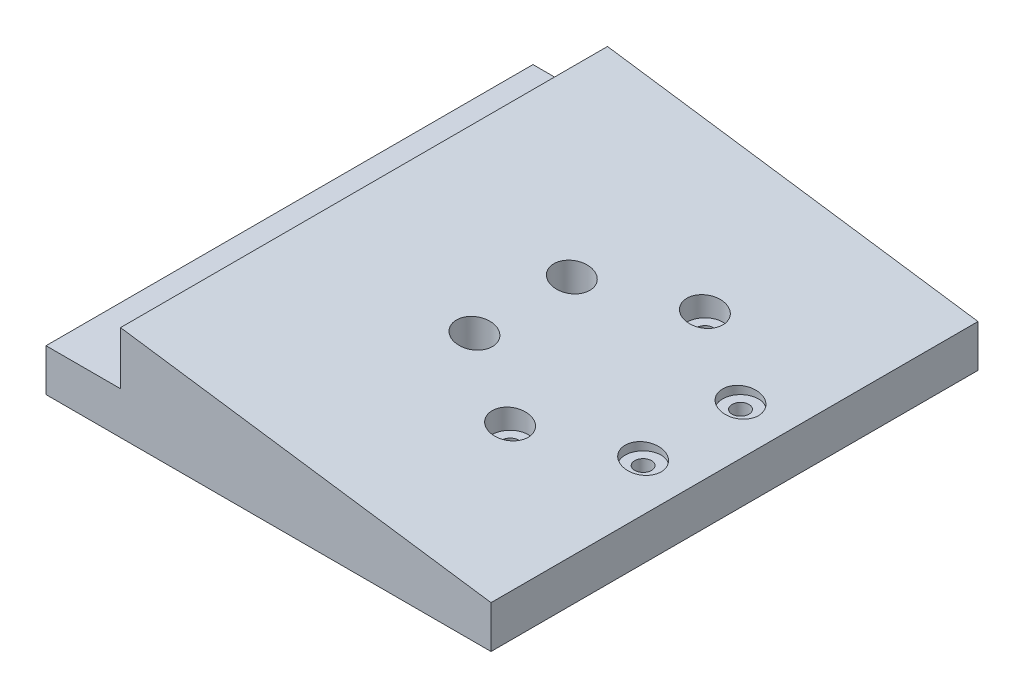
ISO-10303-21;
HEADER;
FILE_DESCRIPTION(('STEP AP214'),'2;1');
FILE_NAME('part.step','',(''),(''),'','','');
FILE_SCHEMA(('AUTOMOTIVE_DESIGN { 1 0 10303 214 1 1 1 1 }'));
ENDSEC;
DATA;
#1=APPLICATION_CONTEXT('core data for automotive mechanical design processes');
#2=APPLICATION_PROTOCOL_DEFINITION('international standard','automotive_design',2000,#1);
#3=PRODUCT_CONTEXT('',#1,'mechanical');
#4=PRODUCT('Part','Part','',(#3));
#5=PRODUCT_RELATED_PRODUCT_CATEGORY('part','',(#4));
#6=PRODUCT_DEFINITION_FORMATION('','',#4);
#7=PRODUCT_DEFINITION_CONTEXT('part definition',#1,'design');
#8=PRODUCT_DEFINITION('design','',#6,#7);
#9=PRODUCT_DEFINITION_SHAPE('','',#8);
#10=(LENGTH_UNIT() NAMED_UNIT(*) SI_UNIT(.MILLI.,.METRE.));
#11=(NAMED_UNIT(*) PLANE_ANGLE_UNIT() SI_UNIT($,.RADIAN.));
#12=(NAMED_UNIT(*) SI_UNIT($,.STERADIAN.) SOLID_ANGLE_UNIT());
#13=UNCERTAINTY_MEASURE_WITH_UNIT(LENGTH_MEASURE(1.E-05),#10,'distance_accuracy_value','');
#14=(GEOMETRIC_REPRESENTATION_CONTEXT(3) GLOBAL_UNCERTAINTY_ASSIGNED_CONTEXT((#13)) GLOBAL_UNIT_ASSIGNED_CONTEXT((#10,
#11,#12)) REPRESENTATION_CONTEXT('',''));
#15=CARTESIAN_POINT('',(0.,0.,0.));
#16=DIRECTION('',(0.,0.,1.));
#17=DIRECTION('',(1.,0.,0.));
#18=AXIS2_PLACEMENT_3D('',#15,#16,#17);
#19=CARTESIAN_POINT('',(52.55,10.,-57.5));
#20=DIRECTION('',(-1.,0.,0.));
#21=DIRECTION('',(0.,0.,1.));
#22=AXIS2_PLACEMENT_3D('',#19,#20,#21);
#23=PLANE('',#22);
#24=DIRECTION('',(0.,0.,-1.));
#25=VECTOR('',#24,1.);
#26=CARTESIAN_POINT('',(52.55,0.,-57.5));
#27=LINE('',#26,#25);
#28=CARTESIAN_POINT('',(52.55,0.,57.5));
#29=VERTEX_POINT('',#28);
#30=CARTESIAN_POINT('',(52.55,0.,-57.5));
#31=VERTEX_POINT('',#30);
#32=EDGE_CURVE('E103',#29,#31,#27,.T.);
#33=ORIENTED_EDGE('',*,*,#32,.T.);
#34=DIRECTION('',(0.,-1.,0.));
#35=VECTOR('',#34,1.);
#36=CARTESIAN_POINT('',(52.55,10.,-57.5));
#37=LINE('',#36,#35);
#38=CARTESIAN_POINT('',(52.55,10.,-57.5));
#39=VERTEX_POINT('',#38);
#40=EDGE_CURVE('E11',#39,#31,#37,.T.);
#41=ORIENTED_EDGE('',*,*,#40,.F.);
#42=DIRECTION('',(0.,0.,-1.));
#43=VECTOR('',#42,1.);
#44=CARTESIAN_POINT('',(52.55,10.,-57.5));
#45=LINE('',#44,#43);
#46=CARTESIAN_POINT('',(52.55,10.,57.5));
#47=VERTEX_POINT('',#46);
#48=EDGE_CURVE('E114',#47,#39,#45,.T.);
#49=ORIENTED_EDGE('',*,*,#48,.F.);
#50=DIRECTION('',(0.,-1.,0.));
#51=VECTOR('',#50,1.);
#52=CARTESIAN_POINT('',(52.55,10.,57.5));
#53=LINE('',#52,#51);
#54=EDGE_CURVE('E58',#47,#29,#53,.T.);
#55=ORIENTED_EDGE('',*,*,#54,.T.);
#56=EDGE_LOOP('',(#33,#41,#49,#55));
#57=FACE_BOUND('',#56,.T.);
#58=ADVANCED_FACE('F33',(#57),#23,.F.);
#59=CARTESIAN_POINT('',(-52.55,10.,-57.5));
#60=DIRECTION('',(0.,0.,1.));
#61=DIRECTION('',(1.,0.,0.));
#62=AXIS2_PLACEMENT_3D('',#59,#60,#61);
#63=PLANE('',#62);
#64=DIRECTION('',(-1.,0.,0.));
#65=VECTOR('',#64,1.);
#66=CARTESIAN_POINT('',(-52.55,0.,-57.5));
#67=LINE('',#66,#65);
#68=CARTESIAN_POINT('',(-52.55,0.,-57.5));
#69=VERTEX_POINT('',#68);
#70=EDGE_CURVE('E129',#31,#69,#67,.T.);
#71=ORIENTED_EDGE('',*,*,#70,.T.);
#72=DIRECTION('',(0.,-1.,0.));
#73=VECTOR('',#72,1.);
#74=CARTESIAN_POINT('',(-52.55,10.,-57.5));
#75=LINE('',#74,#73);
#76=CARTESIAN_POINT('',(-52.55,10.,-57.5));
#77=VERTEX_POINT('',#76);
#78=EDGE_CURVE('E41',#77,#69,#75,.T.);
#79=ORIENTED_EDGE('',*,*,#78,.F.);
#80=DIRECTION('',(-1.,0.,0.));
#81=VECTOR('',#80,1.);
#82=CARTESIAN_POINT('',(-52.55,10.,-57.5));
#83=LINE('',#82,#81);
#84=CARTESIAN_POINT('',(-34.9499999999986,10.,-57.5));
#85=VERTEX_POINT('',#84);
#86=EDGE_CURVE('E110',#85,#77,#83,.T.);
#87=ORIENTED_EDGE('',*,*,#86,.F.);
#88=DIRECTION('',(0.,-1.,0.));
#89=VECTOR('',#88,1.);
#90=CARTESIAN_POINT('',(-34.9499999999983,22.5000000000006,-57.5));
#91=LINE('',#90,#89);
#92=CARTESIAN_POINT('',(-34.9499999999983,22.5000000000006,-57.5));
#93=VERTEX_POINT('',#92);
#94=EDGE_CURVE('E97',#93,#85,#91,.T.);
#95=ORIENTED_EDGE('',*,*,#94,.F.);
#96=DIRECTION('',(-0.989949493661165,0.141421356237319,0.));
#97=VECTOR('',#96,1.);
#98=CARTESIAN_POINT('',(52.55,10.,-57.5));
#99=LINE('',#98,#97);
#100=EDGE_CURVE('E108',#39,#93,#99,.T.);
#101=ORIENTED_EDGE('',*,*,#100,.F.);
#102=ORIENTED_EDGE('',*,*,#40,.T.);
#103=EDGE_LOOP('',(#71,#79,#87,#95,#101,#102));
#104=FACE_BOUND('',#103,.T.);
#105=ADVANCED_FACE('F107',(#104),#63,.F.);
#106=CARTESIAN_POINT('',(-52.55,10.,-57.5));
#107=DIRECTION('',(1.,0.,0.));
#108=DIRECTION('',(0.,0.,-1.));
#109=AXIS2_PLACEMENT_3D('',#106,#107,#108);
#110=PLANE('',#109);
#111=DIRECTION('',(0.,0.,1.));
#112=VECTOR('',#111,1.);
#113=CARTESIAN_POINT('',(-52.55,0.,-57.5));
#114=LINE('',#113,#112);
#115=CARTESIAN_POINT('',(-52.55,0.,57.5));
#116=VERTEX_POINT('',#115);
#117=EDGE_CURVE('E131',#69,#116,#114,.T.);
#118=ORIENTED_EDGE('',*,*,#117,.T.);
#119=DIRECTION('',(0.,-1.,0.));
#120=VECTOR('',#119,1.);
#121=CARTESIAN_POINT('',(-52.55,10.,57.5));
#122=LINE('',#121,#120);
#123=CARTESIAN_POINT('',(-52.55,10.,57.5));
#124=VERTEX_POINT('',#123);
#125=EDGE_CURVE('E135',#124,#116,#122,.T.);
#126=ORIENTED_EDGE('',*,*,#125,.F.);
#127=DIRECTION('',(0.,0.,1.));
#128=VECTOR('',#127,1.);
#129=CARTESIAN_POINT('',(-52.55,10.,-57.5));
#130=LINE('',#129,#128);
#131=EDGE_CURVE('E124',#77,#124,#130,.T.);
#132=ORIENTED_EDGE('',*,*,#131,.F.);
#133=ORIENTED_EDGE('',*,*,#78,.T.);
#134=EDGE_LOOP('',(#118,#126,#132,#133));
#135=FACE_BOUND('',#134,.T.);
#136=ADVANCED_FACE('F215',(#135),#110,.F.);
#137=CARTESIAN_POINT('',(-52.55,10.,57.5));
#138=DIRECTION('',(0.,0.,-1.));
#139=DIRECTION('',(-1.,0.,0.));
#140=AXIS2_PLACEMENT_3D('',#137,#138,#139);
#141=PLANE('',#140);
#142=DIRECTION('',(1.,0.,0.));
#143=VECTOR('',#142,1.);
#144=CARTESIAN_POINT('',(-52.55,0.,57.5));
#145=LINE('',#144,#143);
#146=EDGE_CURVE('E78',#116,#29,#145,.T.);
#147=ORIENTED_EDGE('',*,*,#146,.T.);
#148=ORIENTED_EDGE('',*,*,#54,.F.);
#149=DIRECTION('',(-0.989949493661165,0.141421356237319,0.));
#150=VECTOR('',#149,1.);
#151=CARTESIAN_POINT('',(52.55,10.,57.5));
#152=LINE('',#151,#150);
#153=CARTESIAN_POINT('',(-34.9499999999983,22.5000000000006,57.5));
#154=VERTEX_POINT('',#153);
#155=EDGE_CURVE('E111',#47,#154,#152,.T.);
#156=ORIENTED_EDGE('',*,*,#155,.T.);
#157=DIRECTION('',(0.,-1.,0.));
#158=VECTOR('',#157,1.);
#159=CARTESIAN_POINT('',(-34.9499999999983,22.5000000000006,57.5));
#160=LINE('',#159,#158);
#161=CARTESIAN_POINT('',(-34.9499999999986,10.0000000000005,57.5));
#162=VERTEX_POINT('',#161);
#163=EDGE_CURVE('E99',#154,#162,#160,.T.);
#164=ORIENTED_EDGE('',*,*,#163,.T.);
#165=DIRECTION('',(1.,0.,0.));
#166=VECTOR('',#165,1.);
#167=CARTESIAN_POINT('',(-52.55,10.,57.5));
#168=LINE('',#167,#166);
#169=EDGE_CURVE('E126',#124,#162,#168,.T.);
#170=ORIENTED_EDGE('',*,*,#169,.F.);
#171=ORIENTED_EDGE('',*,*,#125,.T.);
#172=EDGE_LOOP('',(#147,#148,#156,#164,#170,#171));
#173=FACE_BOUND('',#172,.T.);
#174=ADVANCED_FACE('F210',(#173),#141,.F.);
#175=CARTESIAN_POINT('',(0.,10.,0.));
#176=DIRECTION('',(0.,1.,0.));
#177=DIRECTION('',(0.,0.,1.));
#178=AXIS2_PLACEMENT_3D('',#175,#176,#177);
#179=PLANE('',#178);
#180=DIRECTION('',(0.,0.,1.));
#181=VECTOR('',#180,1.);
#182=CARTESIAN_POINT('',(-34.9499999999986,10.0000000000005,-57.5));
#183=LINE('',#182,#181);
#184=EDGE_CURVE('E49',#85,#162,#183,.T.);
#185=ORIENTED_EDGE('',*,*,#184,.F.);
#186=ORIENTED_EDGE('',*,*,#86,.T.);
#187=ORIENTED_EDGE('',*,*,#131,.T.);
#188=ORIENTED_EDGE('',*,*,#169,.T.);
#189=EDGE_LOOP('',(#185,#186,#187,#188));
#190=FACE_BOUND('',#189,.T.);
#191=ADVANCED_FACE('F201',(#190),#179,.T.);
#192=CARTESIAN_POINT('',(0.,0.,0.));
#193=DIRECTION('',(0.,1.,0.));
#194=DIRECTION('',(0.,0.,1.));
#195=AXIS2_PLACEMENT_3D('',#192,#193,#194);
#196=PLANE('',#195);
#197=CARTESIAN_POINT('',(22.55,0.,23.));
#198=DIRECTION('',(0.,-1.,0.));
#199=DIRECTION('',(0.,0.,-1.));
#200=AXIS2_PLACEMENT_3D('',#197,#198,#199);
#201=CIRCLE('',#200,2.);
#202=CARTESIAN_POINT('',(22.55,0.,21.));
#203=VERTEX_POINT('',#202);
#204=EDGE_CURVE('E120',#203,#203,#201,.T.);
#205=ORIENTED_EDGE('',*,*,#204,.F.);
#206=EDGE_LOOP('',(#205));
#207=FACE_BOUND('',#206,.T.);
#208=CARTESIAN_POINT('',(42.4685842870423,0.,11.5000000000008));
#209=DIRECTION('',(0.,-1.,0.));
#210=DIRECTION('',(0.,0.,-1.));
#211=AXIS2_PLACEMENT_3D('',#208,#209,#210);
#212=CIRCLE('',#211,2.00000000000001);
#213=CARTESIAN_POINT('',(42.4685842870423,0.,9.50000000000078));
#214=VERTEX_POINT('',#213);
#215=EDGE_CURVE('E174',#214,#214,#212,.T.);
#216=ORIENTED_EDGE('',*,*,#215,.F.);
#217=EDGE_LOOP('',(#216));
#218=FACE_BOUND('',#217,.T.);
#219=CARTESIAN_POINT('',(42.468584287043,0.,-11.4999999999994));
#220=DIRECTION('',(0.,-1.,0.));
#221=DIRECTION('',(0.,0.,-1.));
#222=AXIS2_PLACEMENT_3D('',#219,#220,#221);
#223=CIRCLE('',#222,1.99999999999979);
#224=CARTESIAN_POINT('',(42.468584287043,0.,-13.4999999999992));
#225=VERTEX_POINT('',#224);
#226=EDGE_CURVE('E178',#225,#225,#223,.T.);
#227=ORIENTED_EDGE('',*,*,#226,.F.);
#228=EDGE_LOOP('',(#227));
#229=FACE_BOUND('',#228,.T.);
#230=CARTESIAN_POINT('',(22.5500000000013,0.,-23.));
#231=DIRECTION('',(0.,-1.,0.));
#232=DIRECTION('',(0.,0.,-1.));
#233=AXIS2_PLACEMENT_3D('',#230,#231,#232);
#234=CIRCLE('',#233,1.99999999999985);
#235=CARTESIAN_POINT('',(22.5500000000013,0.,-24.9999999999998));
#236=VERTEX_POINT('',#235);
#237=EDGE_CURVE('E183',#236,#236,#234,.T.);
#238=ORIENTED_EDGE('',*,*,#237,.F.);
#239=EDGE_LOOP('',(#238));
#240=FACE_BOUND('',#239,.T.);
#241=CARTESIAN_POINT('',(2.63141571295887,0.,-11.5000000000006));
#242=DIRECTION('',(0.,-1.,0.));
#243=DIRECTION('',(0.,0.,-1.));
#244=AXIS2_PLACEMENT_3D('',#241,#242,#243);
#245=CIRCLE('',#244,1.9999999999999);
#246=CARTESIAN_POINT('',(2.63141571295887,0.,-13.5000000000005));
#247=VERTEX_POINT('',#246);
#248=EDGE_CURVE('E190',#247,#247,#245,.T.);
#249=ORIENTED_EDGE('',*,*,#248,.F.);
#250=EDGE_LOOP('',(#249));
#251=FACE_BOUND('',#250,.T.);
#252=CARTESIAN_POINT('',(2.6314157129582,0.,11.4999999999994));
#253=DIRECTION('',(0.,-1.,0.));
#254=DIRECTION('',(0.,0.,-1.));
#255=AXIS2_PLACEMENT_3D('',#252,#253,#254);
#256=CIRCLE('',#255,2.);
#257=CARTESIAN_POINT('',(2.6314157129582,0.,9.49999999999939));
#258=VERTEX_POINT('',#257);
#259=EDGE_CURVE('E187',#258,#258,#256,.T.);
#260=ORIENTED_EDGE('',*,*,#259,.F.);
#261=EDGE_LOOP('',(#260));
#262=FACE_BOUND('',#261,.T.);
#263=ORIENTED_EDGE('',*,*,#32,.F.);
#264=ORIENTED_EDGE('',*,*,#146,.F.);
#265=ORIENTED_EDGE('',*,*,#117,.F.);
#266=ORIENTED_EDGE('',*,*,#70,.F.);
#267=EDGE_LOOP('',(#263,#264,#265,#266));
#268=FACE_BOUND('',#267,.T.);
#269=ADVANCED_FACE('F198',(#207,#218,#229,#240,#251,#262,#268),#196,.F.);
#270=CARTESIAN_POINT('',(-34.9499999999983,22.5000000000006,-57.5));
#271=DIRECTION('',(-1.,0.,0.));
#272=DIRECTION('',(0.,-1.,0.));
#273=AXIS2_PLACEMENT_3D('',#270,#271,#272);
#274=PLANE('',#273);
#275=ORIENTED_EDGE('',*,*,#163,.F.);
#276=DIRECTION('',(0.,0.,1.));
#277=VECTOR('',#276,1.);
#278=CARTESIAN_POINT('',(-34.9499999999983,22.5000000000006,-57.5));
#279=LINE('',#278,#277);
#280=EDGE_CURVE('E94',#93,#154,#279,.T.);
#281=ORIENTED_EDGE('',*,*,#280,.F.);
#282=ORIENTED_EDGE('',*,*,#94,.T.);
#283=ORIENTED_EDGE('',*,*,#184,.T.);
#284=EDGE_LOOP('',(#275,#281,#282,#283));
#285=FACE_BOUND('',#284,.T.);
#286=ADVANCED_FACE('F96',(#285),#274,.T.);
#287=CARTESIAN_POINT('',(52.55,10.,-57.5));
#288=DIRECTION('',(0.141421356237319,0.989949493661165,0.));
#289=DIRECTION('',(-0.989949493661165,0.141421356237319,0.));
#290=AXIS2_PLACEMENT_3D('',#287,#288,#289);
#291=PLANE('',#290);
#292=CARTESIAN_POINT('',(22.55,14.2857142857146,-23.));
#293=DIRECTION('',(0.141421356237319,0.989949493661165,0.));
#294=DIRECTION('',(-0.989949493661165,0.141421356237319,0.));
#295=AXIS2_PLACEMENT_3D('',#292,#293,#294);
#296=ELLIPSE('',#295,4.2931483143469,4.25);
#297=CARTESIAN_POINT('',(18.3,14.8928571428575,-23.));
#298=VERTEX_POINT('',#297);
#299=EDGE_CURVE('E36',#298,#298,#296,.F.);
#300=ORIENTED_EDGE('',*,*,#299,.T.);
#301=EDGE_LOOP('',(#300));
#302=FACE_BOUND('',#301,.T.);
#303=CARTESIAN_POINT('',(42.4685842870416,11.4402022447084,-11.4999999999997));
#304=DIRECTION('',(0.141421356237319,0.989949493661165,0.));
#305=DIRECTION('',(-0.989949493661165,0.141421356237319,0.));
#306=AXIS2_PLACEMENT_3D('',#303,#304,#305);
#307=ELLIPSE('',#306,4.2931483143469,4.25);
#308=CARTESIAN_POINT('',(38.2185842870416,12.0473451018513,-11.4999999999997));
#309=VERTEX_POINT('',#308);
#310=EDGE_CURVE('E169',#309,#309,#307,.F.);
#311=ORIENTED_EDGE('',*,*,#310,.T.);
#312=EDGE_LOOP('',(#311));
#313=FACE_BOUND('',#312,.T.);
#314=CARTESIAN_POINT('',(42.4685842870412,11.4402022447085,11.5000000000004));
#315=DIRECTION('',(0.141421356237319,0.989949493661165,0.));
#316=DIRECTION('',(-0.989949493661165,0.141421356237319,0.));
#317=AXIS2_PLACEMENT_3D('',#314,#315,#316);
#318=ELLIPSE('',#317,4.2931483143469,4.25);
#319=CARTESIAN_POINT('',(38.2185842870412,12.0473451018514,11.5000000000004));
#320=VERTEX_POINT('',#319);
#321=EDGE_CURVE('E167',#320,#320,#318,.F.);
#322=ORIENTED_EDGE('',*,*,#321,.T.);
#323=EDGE_LOOP('',(#322));
#324=FACE_BOUND('',#323,.T.);
#325=CARTESIAN_POINT('',(22.55,14.2857142857146,23.));
#326=DIRECTION('',(0.141421356237319,0.989949493661165,0.));
#327=DIRECTION('',(-0.989949493661165,0.141421356237319,0.));
#328=AXIS2_PLACEMENT_3D('',#325,#326,#327);
#329=ELLIPSE('',#328,4.29314831434581,4.24999999999892);
#330=CARTESIAN_POINT('',(18.3000000000011,14.8928571428573,23.));
#331=VERTEX_POINT('',#330);
#332=EDGE_CURVE('E164',#331,#331,#329,.F.);
#333=ORIENTED_EDGE('',*,*,#332,.T.);
#334=EDGE_LOOP('',(#333));
#335=FACE_BOUND('',#334,.T.);
#336=CARTESIAN_POINT('',(2.63141571295789,17.1312263267208,11.5));
#337=DIRECTION('',(0.141421356237319,0.989949493661165,0.));
#338=DIRECTION('',(-0.989949493661165,0.141421356237319,0.));
#339=AXIS2_PLACEMENT_3D('',#336,#337,#338);
#340=ELLIPSE('',#339,4.29314831434623,4.24999999999933);
#341=CARTESIAN_POINT('',(-1.61858428704144,17.7383691838636,11.5));
#342=VERTEX_POINT('',#341);
#343=EDGE_CURVE('E161',#342,#342,#340,.F.);
#344=ORIENTED_EDGE('',*,*,#343,.T.);
#345=EDGE_LOOP('',(#344));
#346=FACE_BOUND('',#345,.T.);
#347=CARTESIAN_POINT('',(2.63141571295755,17.1312263267208,-11.5000000000005));
#348=DIRECTION('',(0.141421356237319,0.989949493661165,0.));
#349=DIRECTION('',(-0.989949493661165,0.141421356237319,0.));
#350=AXIS2_PLACEMENT_3D('',#347,#348,#349);
#351=ELLIPSE('',#350,4.2931483143469,4.25);
#352=CARTESIAN_POINT('',(-1.61858428704246,17.7383691838637,-11.5000000000005));
#353=VERTEX_POINT('',#352);
#354=EDGE_CURVE('E158',#353,#353,#351,.F.);
#355=ORIENTED_EDGE('',*,*,#354,.T.);
#356=EDGE_LOOP('',(#355));
#357=FACE_BOUND('',#356,.T.);
#358=ORIENTED_EDGE('',*,*,#155,.F.);
#359=ORIENTED_EDGE('',*,*,#48,.T.);
#360=ORIENTED_EDGE('',*,*,#100,.T.);
#361=ORIENTED_EDGE('',*,*,#280,.T.);
#362=EDGE_LOOP('',(#358,#359,#360,#361));
#363=FACE_BOUND('',#362,.T.);
#364=ADVANCED_FACE('F113',(#302,#313,#324,#335,#346,#357,#363),#291,.T.);
#365=CARTESIAN_POINT('',(2.6314157129582,20.,11.4999999999994));
#366=DIRECTION('',(0.,-1.,0.));
#367=DIRECTION('',(0.,0.,-1.));
#368=AXIS2_PLACEMENT_3D('',#365,#366,#367);
#369=CYLINDRICAL_SURFACE('',#368,2.);
#370=CARTESIAN_POINT('',(2.6314157129582,10.0000000000001,11.4999999999994));
#371=DIRECTION('',(0.,-1.,0.));
#372=DIRECTION('',(0.,0.,-1.));
#373=AXIS2_PLACEMENT_3D('',#370,#371,#372);
#374=CIRCLE('',#373,2.);
#375=CARTESIAN_POINT('',(2.6314157129582,10.0000000000001,9.49999999999939));
#376=VERTEX_POINT('',#375);
#377=EDGE_CURVE('E155',#376,#376,#374,.F.);
#378=ORIENTED_EDGE('',*,*,#377,.T.);
#379=EDGE_LOOP('',(#378));
#380=FACE_BOUND('',#379,.T.);
#381=ORIENTED_EDGE('',*,*,#259,.T.);
#382=EDGE_LOOP('',(#381));
#383=FACE_BOUND('',#382,.T.);
#384=ADVANCED_FACE('F269',(#380,#383),#369,.F.);
#385=CARTESIAN_POINT('',(2.63141571295887,20.,-11.5000000000006));
#386=DIRECTION('',(0.,-1.,0.));
#387=DIRECTION('',(0.,0.,-1.));
#388=AXIS2_PLACEMENT_3D('',#385,#386,#387);
#389=CYLINDRICAL_SURFACE('',#388,1.9999999999999);
#390=CARTESIAN_POINT('',(2.63141571295887,10.0000000000001,-11.5000000000006));
#391=DIRECTION('',(0.,-1.,0.));
#392=DIRECTION('',(0.,0.,-1.));
#393=AXIS2_PLACEMENT_3D('',#390,#391,#392);
#394=CIRCLE('',#393,1.9999999999999);
#395=CARTESIAN_POINT('',(2.63141571295887,10.0000000000001,-13.5000000000005));
#396=VERTEX_POINT('',#395);
#397=EDGE_CURVE('E152',#396,#396,#394,.F.);
#398=ORIENTED_EDGE('',*,*,#397,.T.);
#399=EDGE_LOOP('',(#398));
#400=FACE_BOUND('',#399,.T.);
#401=ORIENTED_EDGE('',*,*,#248,.T.);
#402=EDGE_LOOP('',(#401));
#403=FACE_BOUND('',#402,.T.);
#404=ADVANCED_FACE('F278',(#400,#403),#389,.F.);
#405=CARTESIAN_POINT('',(22.5500000000013,20.,-23.));
#406=DIRECTION('',(0.,-1.,0.));
#407=DIRECTION('',(0.,0.,-1.));
#408=AXIS2_PLACEMENT_3D('',#405,#406,#407);
#409=CYLINDRICAL_SURFACE('',#408,1.99999999999985);
#410=CARTESIAN_POINT('',(22.5500000000013,10.0000000000001,-23.));
#411=DIRECTION('',(0.,-1.,0.));
#412=DIRECTION('',(0.,0.,-1.));
#413=AXIS2_PLACEMENT_3D('',#410,#411,#412);
#414=CIRCLE('',#413,1.99999999999985);
#415=CARTESIAN_POINT('',(22.5500000000013,10.0000000000001,-24.9999999999998));
#416=VERTEX_POINT('',#415);
#417=EDGE_CURVE('E149',#416,#416,#414,.F.);
#418=ORIENTED_EDGE('',*,*,#417,.T.);
#419=EDGE_LOOP('',(#418));
#420=FACE_BOUND('',#419,.T.);
#421=ORIENTED_EDGE('',*,*,#237,.T.);
#422=EDGE_LOOP('',(#421));
#423=FACE_BOUND('',#422,.T.);
#424=ADVANCED_FACE('F196',(#420,#423),#409,.F.);
#425=CARTESIAN_POINT('',(42.468584287043,20.,-11.4999999999994));
#426=DIRECTION('',(0.,-1.,0.));
#427=DIRECTION('',(0.,0.,-1.));
#428=AXIS2_PLACEMENT_3D('',#425,#426,#427);
#429=CYLINDRICAL_SURFACE('',#428,1.99999999999979);
#430=CARTESIAN_POINT('',(42.468584287043,10.0000000000001,-11.4999999999994));
#431=DIRECTION('',(0.,-1.,0.));
#432=DIRECTION('',(0.,0.,-1.));
#433=AXIS2_PLACEMENT_3D('',#430,#431,#432);
#434=CIRCLE('',#433,1.99999999999979);
#435=CARTESIAN_POINT('',(42.468584287043,10.0000000000001,-13.4999999999992));
#436=VERTEX_POINT('',#435);
#437=EDGE_CURVE('E146',#436,#436,#434,.F.);
#438=ORIENTED_EDGE('',*,*,#437,.T.);
#439=EDGE_LOOP('',(#438));
#440=FACE_BOUND('',#439,.T.);
#441=ORIENTED_EDGE('',*,*,#226,.T.);
#442=EDGE_LOOP('',(#441));
#443=FACE_BOUND('',#442,.T.);
#444=ADVANCED_FACE('F297',(#440,#443),#429,.F.);
#445=CARTESIAN_POINT('',(42.4685842870423,20.,11.5000000000008));
#446=DIRECTION('',(0.,-1.,0.));
#447=DIRECTION('',(0.,0.,-1.));
#448=AXIS2_PLACEMENT_3D('',#445,#446,#447);
#449=CYLINDRICAL_SURFACE('',#448,2.00000000000001);
#450=CARTESIAN_POINT('',(42.4685842870423,10.0000000000001,11.5000000000008));
#451=DIRECTION('',(0.,-1.,0.));
#452=DIRECTION('',(0.,0.,-1.));
#453=AXIS2_PLACEMENT_3D('',#450,#451,#452);
#454=CIRCLE('',#453,2.00000000000001);
#455=CARTESIAN_POINT('',(42.4685842870423,10.0000000000001,9.50000000000078));
#456=VERTEX_POINT('',#455);
#457=EDGE_CURVE('E142',#456,#456,#454,.F.);
#458=ORIENTED_EDGE('',*,*,#457,.T.);
#459=EDGE_LOOP('',(#458));
#460=FACE_BOUND('',#459,.T.);
#461=ORIENTED_EDGE('',*,*,#215,.T.);
#462=EDGE_LOOP('',(#461));
#463=FACE_BOUND('',#462,.T.);
#464=ADVANCED_FACE('F307',(#460,#463),#449,.F.);
#465=CARTESIAN_POINT('',(22.55,20.,23.));
#466=DIRECTION('',(0.,-1.,0.));
#467=DIRECTION('',(0.,0.,-1.));
#468=AXIS2_PLACEMENT_3D('',#465,#466,#467);
#469=CYLINDRICAL_SURFACE('',#468,2.);
#470=CARTESIAN_POINT('',(22.55,10.0000000000001,23.));
#471=DIRECTION('',(0.,-1.,0.));
#472=DIRECTION('',(0.,0.,-1.));
#473=AXIS2_PLACEMENT_3D('',#470,#471,#472);
#474=CIRCLE('',#473,2.);
#475=CARTESIAN_POINT('',(22.55,10.0000000000001,21.));
#476=VERTEX_POINT('',#475);
#477=EDGE_CURVE('E139',#476,#476,#474,.F.);
#478=ORIENTED_EDGE('',*,*,#477,.T.);
#479=EDGE_LOOP('',(#478));
#480=FACE_BOUND('',#479,.T.);
#481=ORIENTED_EDGE('',*,*,#204,.T.);
#482=EDGE_LOOP('',(#481));
#483=FACE_BOUND('',#482,.T.);
#484=ADVANCED_FACE('F317',(#480,#483),#469,.F.);
#485=CARTESIAN_POINT('',(22.55,10.0000000000001,23.));
#486=DIRECTION('',(0.,-1.,0.));
#487=DIRECTION('',(0.,0.,-1.));
#488=AXIS2_PLACEMENT_3D('',#485,#486,#487);
#489=PLANE('',#488);
#490=CARTESIAN_POINT('',(22.55,10.0000000000001,23.));
#491=DIRECTION('',(0.,-1.,0.));
#492=DIRECTION('',(0.,0.,-1.));
#493=AXIS2_PLACEMENT_3D('',#490,#491,#492);
#494=CIRCLE('',#493,4.24999999999892);
#495=CARTESIAN_POINT('',(22.55,10.0000000000001,18.7500000000011));
#496=VERTEX_POINT('',#495);
#497=EDGE_CURVE('E457',#496,#496,#494,.T.);
#498=ORIENTED_EDGE('',*,*,#497,.F.);
#499=EDGE_LOOP('',(#498));
#500=FACE_BOUND('',#499,.T.);
#501=ORIENTED_EDGE('',*,*,#477,.F.);
#502=EDGE_LOOP('',(#501));
#503=FACE_BOUND('',#502,.T.);
#504=ADVANCED_FACE('F327',(#500,#503),#489,.F.);
#505=CARTESIAN_POINT('',(22.55,10.0000000000001,23.));
#506=DIRECTION('',(0.,1.,0.));
#507=DIRECTION('',(0.,0.,1.));
#508=AXIS2_PLACEMENT_3D('',#505,#506,#507);
#509=CYLINDRICAL_SURFACE('',#508,4.24999999999892);
#510=ORIENTED_EDGE('',*,*,#332,.F.);
#511=EDGE_LOOP('',(#510));
#512=FACE_BOUND('',#511,.T.);
#513=ORIENTED_EDGE('',*,*,#497,.T.);
#514=EDGE_LOOP('',(#513));
#515=FACE_BOUND('',#514,.T.);
#516=ADVANCED_FACE('F337',(#512,#515),#509,.F.);
#517=CARTESIAN_POINT('',(42.4685842870412,10.0000000000001,11.5000000000004));
#518=DIRECTION('',(0.,-1.,0.));
#519=DIRECTION('',(0.,0.,-1.));
#520=AXIS2_PLACEMENT_3D('',#517,#518,#519);
#521=PLANE('',#520);
#522=CARTESIAN_POINT('',(42.4685842870412,10.0000000000001,11.5000000000004));
#523=DIRECTION('',(0.,-1.,0.));
#524=DIRECTION('',(0.,0.,-1.));
#525=AXIS2_PLACEMENT_3D('',#522,#523,#524);
#526=CIRCLE('',#525,4.25);
#527=CARTESIAN_POINT('',(42.4685842870412,10.0000000000001,7.25000000000038));
#528=VERTEX_POINT('',#527);
#529=EDGE_CURVE('E462',#528,#528,#526,.T.);
#530=ORIENTED_EDGE('',*,*,#529,.F.);
#531=EDGE_LOOP('',(#530));
#532=FACE_BOUND('',#531,.T.);
#533=ORIENTED_EDGE('',*,*,#457,.F.);
#534=EDGE_LOOP('',(#533));
#535=FACE_BOUND('',#534,.T.);
#536=ADVANCED_FACE('F347',(#532,#535),#521,.F.);
#537=CARTESIAN_POINT('',(42.4685842870412,10.0000000000001,11.5000000000004));
#538=DIRECTION('',(0.,1.,0.));
#539=DIRECTION('',(0.,0.,1.));
#540=AXIS2_PLACEMENT_3D('',#537,#538,#539);
#541=CYLINDRICAL_SURFACE('',#540,4.25);
#542=ORIENTED_EDGE('',*,*,#321,.F.);
#543=EDGE_LOOP('',(#542));
#544=FACE_BOUND('',#543,.T.);
#545=ORIENTED_EDGE('',*,*,#529,.T.);
#546=EDGE_LOOP('',(#545));
#547=FACE_BOUND('',#546,.T.);
#548=ADVANCED_FACE('F357',(#544,#547),#541,.F.);
#549=CARTESIAN_POINT('',(42.4685842870416,10.0000000000001,-11.4999999999997));
#550=DIRECTION('',(0.,-1.,0.));
#551=DIRECTION('',(0.,0.,-1.));
#552=AXIS2_PLACEMENT_3D('',#549,#550,#551);
#553=PLANE('',#552);
#554=CARTESIAN_POINT('',(42.4685842870416,10.0000000000001,-11.4999999999997));
#555=DIRECTION('',(0.,-1.,0.));
#556=DIRECTION('',(0.,0.,-1.));
#557=AXIS2_PLACEMENT_3D('',#554,#555,#556);
#558=CIRCLE('',#557,4.25);
#559=CARTESIAN_POINT('',(42.4685842870416,10.0000000000001,-15.7499999999997));
#560=VERTEX_POINT('',#559);
#561=EDGE_CURVE('E466',#560,#560,#558,.T.);
#562=ORIENTED_EDGE('',*,*,#561,.F.);
#563=EDGE_LOOP('',(#562));
#564=FACE_BOUND('',#563,.T.);
#565=ORIENTED_EDGE('',*,*,#437,.F.);
#566=EDGE_LOOP('',(#565));
#567=FACE_BOUND('',#566,.T.);
#568=ADVANCED_FACE('F367',(#564,#567),#553,.F.);
#569=CARTESIAN_POINT('',(42.4685842870416,10.0000000000001,-11.4999999999997));
#570=DIRECTION('',(0.,1.,0.));
#571=DIRECTION('',(0.,0.,1.));
#572=AXIS2_PLACEMENT_3D('',#569,#570,#571);
#573=CYLINDRICAL_SURFACE('',#572,4.25);
#574=ORIENTED_EDGE('',*,*,#310,.F.);
#575=EDGE_LOOP('',(#574));
#576=FACE_BOUND('',#575,.T.);
#577=ORIENTED_EDGE('',*,*,#561,.T.);
#578=EDGE_LOOP('',(#577));
#579=FACE_BOUND('',#578,.T.);
#580=ADVANCED_FACE('F377',(#576,#579),#573,.F.);
#581=CARTESIAN_POINT('',(22.55,10.0000000000001,-23.));
#582=DIRECTION('',(0.,-1.,0.));
#583=DIRECTION('',(0.,0.,-1.));
#584=AXIS2_PLACEMENT_3D('',#581,#582,#583);
#585=PLANE('',#584);
#586=CARTESIAN_POINT('',(22.55,10.0000000000001,-23.));
#587=DIRECTION('',(0.,-1.,0.));
#588=DIRECTION('',(0.,0.,-1.));
#589=AXIS2_PLACEMENT_3D('',#586,#587,#588);
#590=CIRCLE('',#589,4.25);
#591=CARTESIAN_POINT('',(22.55,10.0000000000001,-27.25));
#592=VERTEX_POINT('',#591);
#593=EDGE_CURVE('E143',#592,#592,#590,.T.);
#594=ORIENTED_EDGE('',*,*,#593,.F.);
#595=EDGE_LOOP('',(#594));
#596=FACE_BOUND('',#595,.T.);
#597=ORIENTED_EDGE('',*,*,#417,.F.);
#598=EDGE_LOOP('',(#597));
#599=FACE_BOUND('',#598,.T.);
#600=ADVANCED_FACE('F387',(#596,#599),#585,.F.);
#601=CARTESIAN_POINT('',(22.55,10.0000000000001,-23.));
#602=DIRECTION('',(0.,1.,0.));
#603=DIRECTION('',(0.,0.,1.));
#604=AXIS2_PLACEMENT_3D('',#601,#602,#603);
#605=CYLINDRICAL_SURFACE('',#604,4.25);
#606=ORIENTED_EDGE('',*,*,#299,.F.);
#607=EDGE_LOOP('',(#606));
#608=FACE_BOUND('',#607,.T.);
#609=ORIENTED_EDGE('',*,*,#593,.T.);
#610=EDGE_LOOP('',(#609));
#611=FACE_BOUND('',#610,.T.);
#612=ADVANCED_FACE('F397',(#608,#611),#605,.F.);
#613=CARTESIAN_POINT('',(2.63141571295755,10.0000000000001,-11.5000000000005));
#614=DIRECTION('',(0.,-1.,0.));
#615=DIRECTION('',(0.,0.,-1.));
#616=AXIS2_PLACEMENT_3D('',#613,#614,#615);
#617=PLANE('',#616);
#618=CARTESIAN_POINT('',(2.63141571295755,10.0000000000001,-11.5000000000005));
#619=DIRECTION('',(0.,-1.,0.));
#620=DIRECTION('',(0.,0.,-1.));
#621=AXIS2_PLACEMENT_3D('',#618,#619,#620);
#622=CIRCLE('',#621,4.25);
#623=CARTESIAN_POINT('',(2.63141571295755,10.0000000000001,-15.7500000000005));
#624=VERTEX_POINT('',#623);
#625=EDGE_CURVE('E456',#624,#624,#622,.T.);
#626=ORIENTED_EDGE('',*,*,#625,.F.);
#627=EDGE_LOOP('',(#626));
#628=FACE_BOUND('',#627,.T.);
#629=ORIENTED_EDGE('',*,*,#397,.F.);
#630=EDGE_LOOP('',(#629));
#631=FACE_BOUND('',#630,.T.);
#632=ADVANCED_FACE('F407',(#628,#631),#617,.F.);
#633=CARTESIAN_POINT('',(2.63141571295755,10.0000000000001,-11.5000000000005));
#634=DIRECTION('',(0.,1.,0.));
#635=DIRECTION('',(0.,0.,1.));
#636=AXIS2_PLACEMENT_3D('',#633,#634,#635);
#637=CYLINDRICAL_SURFACE('',#636,4.25);
#638=ORIENTED_EDGE('',*,*,#354,.F.);
#639=EDGE_LOOP('',(#638));
#640=FACE_BOUND('',#639,.T.);
#641=ORIENTED_EDGE('',*,*,#625,.T.);
#642=EDGE_LOOP('',(#641));
#643=FACE_BOUND('',#642,.T.);
#644=ADVANCED_FACE('F417',(#640,#643),#637,.F.);
#645=CARTESIAN_POINT('',(2.63141571295789,10.0000000000001,11.5));
#646=DIRECTION('',(0.,-1.,0.));
#647=DIRECTION('',(0.,0.,-1.));
#648=AXIS2_PLACEMENT_3D('',#645,#646,#647);
#649=PLANE('',#648);
#650=CARTESIAN_POINT('',(2.63141571295789,10.0000000000001,11.5));
#651=DIRECTION('',(0.,-1.,0.));
#652=DIRECTION('',(0.,0.,-1.));
#653=AXIS2_PLACEMENT_3D('',#650,#651,#652);
#654=CIRCLE('',#653,4.24999999999933);
#655=CARTESIAN_POINT('',(2.63141571295789,10.0000000000001,7.25000000000066));
#656=VERTEX_POINT('',#655);
#657=EDGE_CURVE('E455',#656,#656,#654,.T.);
#658=ORIENTED_EDGE('',*,*,#657,.F.);
#659=EDGE_LOOP('',(#658));
#660=FACE_BOUND('',#659,.T.);
#661=ORIENTED_EDGE('',*,*,#377,.F.);
#662=EDGE_LOOP('',(#661));
#663=FACE_BOUND('',#662,.T.);
#664=ADVANCED_FACE('F427',(#660,#663),#649,.F.);
#665=CARTESIAN_POINT('',(2.63141571295789,10.0000000000001,11.5));
#666=DIRECTION('',(0.,1.,0.));
#667=DIRECTION('',(0.,0.,1.));
#668=AXIS2_PLACEMENT_3D('',#665,#666,#667);
#669=CYLINDRICAL_SURFACE('',#668,4.24999999999933);
#670=ORIENTED_EDGE('',*,*,#343,.F.);
#671=EDGE_LOOP('',(#670));
#672=FACE_BOUND('',#671,.T.);
#673=ORIENTED_EDGE('',*,*,#657,.T.);
#674=EDGE_LOOP('',(#673));
#675=FACE_BOUND('',#674,.T.);
#676=ADVANCED_FACE('F437',(#672,#675),#669,.F.);
#677=CLOSED_SHELL('',(#58,#105,#136,#174,#191,#269,#286,#364,#384,#404,#424,#444,#464,#484,#504,
#516,#536,#548,#568,#580,#600,#612,#632,#644,#664,#676));
#678=MANIFOLD_SOLID_BREP('B2',#677);
#679=ADVANCED_BREP_SHAPE_REPRESENTATION('',(#18,#678),#14);
#680=SHAPE_DEFINITION_REPRESENTATION(#9,#679);
ENDSEC;
END-ISO-10303-21;
